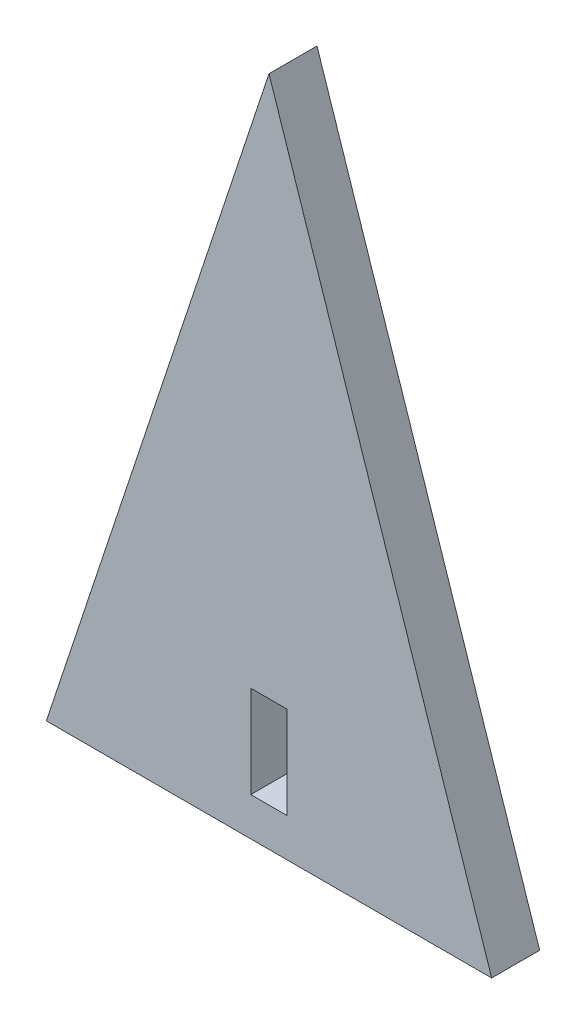
ISO-10303-21;
HEADER;
FILE_DESCRIPTION(('STEP AP214'),'2;1');
FILE_NAME('part.step','',(''),(''),'','','');
FILE_SCHEMA(('AUTOMOTIVE_DESIGN { 1 0 10303 214 1 1 1 1 }'));
ENDSEC;
DATA;
#1=APPLICATION_CONTEXT('core data for automotive mechanical design processes');
#2=APPLICATION_PROTOCOL_DEFINITION('international standard','automotive_design',2000,#1);
#3=PRODUCT_CONTEXT('',#1,'mechanical');
#4=PRODUCT('Part','Part','',(#3));
#5=PRODUCT_RELATED_PRODUCT_CATEGORY('part','',(#4));
#6=PRODUCT_DEFINITION_FORMATION('','',#4);
#7=PRODUCT_DEFINITION_CONTEXT('part definition',#1,'design');
#8=PRODUCT_DEFINITION('design','',#6,#7);
#9=PRODUCT_DEFINITION_SHAPE('','',#8);
#10=(LENGTH_UNIT() NAMED_UNIT(*) SI_UNIT(.MILLI.,.METRE.));
#11=(NAMED_UNIT(*) PLANE_ANGLE_UNIT() SI_UNIT($,.RADIAN.));
#12=(NAMED_UNIT(*) SI_UNIT($,.STERADIAN.) SOLID_ANGLE_UNIT());
#13=UNCERTAINTY_MEASURE_WITH_UNIT(LENGTH_MEASURE(1.E-05),#10,'distance_accuracy_value','');
#14=(GEOMETRIC_REPRESENTATION_CONTEXT(3) GLOBAL_UNCERTAINTY_ASSIGNED_CONTEXT((#13)) GLOBAL_UNIT_ASSIGNED_CONTEXT((#10,
#11,#12)) REPRESENTATION_CONTEXT('',''));
#15=CARTESIAN_POINT('',(0.,0.,0.));
#16=DIRECTION('',(0.,0.,1.));
#17=DIRECTION('',(1.,0.,0.));
#18=AXIS2_PLACEMENT_3D('',#15,#16,#17);
#19=CARTESIAN_POINT('',(0.,0.,3.175));
#20=DIRECTION('',(0.,0.,-1.));
#21=DIRECTION('',(-1.,0.,0.));
#22=AXIS2_PLACEMENT_3D('',#19,#20,#21);
#23=PLANE('',#22);
#24=DIRECTION('',(1.,0.,0.));
#25=VECTOR('',#24,1.);
#26=CARTESIAN_POINT('',(-16.0846255971627,-40.3688020775263,3.175));
#27=LINE('',#26,#25);
#28=CARTESIAN_POINT('',(-16.0846255971627,-40.3688020775263,3.175));
#29=VERTEX_POINT('',#28);
#30=CARTESIAN_POINT('',(13.3793744028373,-40.3688020775263,3.175));
#31=VERTEX_POINT('',#30);
#32=EDGE_CURVE('E134',#29,#31,#27,.T.);
#33=ORIENTED_EDGE('',*,*,#32,.T.);
#34=DIRECTION('',(-0.314600059139954,0.94922431637055,0.));
#35=VECTOR('',#34,1.);
#36=CARTESIAN_POINT('',(-1.35262559716273,4.08119792247373,3.175));
#37=LINE('',#36,#35);
#38=CARTESIAN_POINT('',(-1.35262559716273,4.08119792247373,3.175));
#39=VERTEX_POINT('',#38);
#40=EDGE_CURVE('E137',#31,#39,#37,.T.);
#41=ORIENTED_EDGE('',*,*,#40,.T.);
#42=DIRECTION('',(-0.314600059139954,-0.94922431637055,0.));
#43=VECTOR('',#42,1.);
#44=CARTESIAN_POINT('',(-16.0846255971627,-40.3688020775263,3.175));
#45=LINE('',#44,#43);
#46=EDGE_CURVE('E140',#39,#29,#45,.T.);
#47=ORIENTED_EDGE('',*,*,#46,.T.);
#48=EDGE_LOOP('',(#33,#41,#47));
#49=FACE_BOUND('',#48,.T.);
#50=DIRECTION('',(0.,-1.,0.));
#51=VECTOR('',#50,1.);
#52=CARTESIAN_POINT('',(-2.55912559716272,-37.8288020775262,3.175));
#53=LINE('',#52,#51);
#54=CARTESIAN_POINT('',(-2.55912559716272,-31.7328020775262,3.175));
#55=VERTEX_POINT('',#54);
#56=CARTESIAN_POINT('',(-2.55912559716272,-37.8288020775262,3.175));
#57=VERTEX_POINT('',#56);
#58=EDGE_CURVE('E98',#55,#57,#53,.T.);
#59=ORIENTED_EDGE('',*,*,#58,.F.);
#60=DIRECTION('',(-1.,0.,0.));
#61=VECTOR('',#60,1.);
#62=CARTESIAN_POINT('',(-2.55912559716272,-31.7328020775262,3.175));
#63=LINE('',#62,#61);
#64=CARTESIAN_POINT('',(-0.146125597162723,-31.7328020775262,3.175));
#65=VERTEX_POINT('',#64);
#66=EDGE_CURVE('E120',#65,#55,#63,.T.);
#67=ORIENTED_EDGE('',*,*,#66,.F.);
#68=DIRECTION('',(0.,1.,0.));
#69=VECTOR('',#68,1.);
#70=CARTESIAN_POINT('',(-0.146125597162723,-37.8288020775262,3.175));
#71=LINE('',#70,#69);
#72=CARTESIAN_POINT('',(-0.146125597162723,-37.8288020775262,3.175));
#73=VERTEX_POINT('',#72);
#74=EDGE_CURVE('E118',#73,#65,#71,.T.);
#75=ORIENTED_EDGE('',*,*,#74,.F.);
#76=DIRECTION('',(1.,0.,0.));
#77=VECTOR('',#76,1.);
#78=CARTESIAN_POINT('',(-2.55912559716272,-37.8288020775262,3.175));
#79=LINE('',#78,#77);
#80=EDGE_CURVE('E106',#57,#73,#79,.T.);
#81=ORIENTED_EDGE('',*,*,#80,.F.);
#82=EDGE_LOOP('',(#59,#67,#75,#81));
#83=FACE_BOUND('',#82,.T.);
#84=ADVANCED_FACE('F39',(#49,#83),#23,.F.);
#85=CARTESIAN_POINT('',(0.,0.,0.));
#86=DIRECTION('',(0.,0.,-1.));
#87=DIRECTION('',(-1.,0.,0.));
#88=AXIS2_PLACEMENT_3D('',#85,#86,#87);
#89=PLANE('',#88);
#90=DIRECTION('',(1.,0.,0.));
#91=VECTOR('',#90,1.);
#92=CARTESIAN_POINT('',(-16.0846255971627,-40.3688020775263,0.));
#93=LINE('',#92,#91);
#94=CARTESIAN_POINT('',(-16.0846255971627,-40.3688020775263,0.));
#95=VERTEX_POINT('',#94);
#96=CARTESIAN_POINT('',(13.3793744028373,-40.3688020775263,0.));
#97=VERTEX_POINT('',#96);
#98=EDGE_CURVE('E114',#95,#97,#93,.T.);
#99=ORIENTED_EDGE('',*,*,#98,.F.);
#100=DIRECTION('',(-0.314600059139954,-0.94922431637055,0.));
#101=VECTOR('',#100,1.);
#102=CARTESIAN_POINT('',(-16.0846255971627,-40.3688020775263,0.));
#103=LINE('',#102,#101);
#104=CARTESIAN_POINT('',(-1.35262559716273,4.08119792247373,0.));
#105=VERTEX_POINT('',#104);
#106=EDGE_CURVE('E138',#105,#95,#103,.T.);
#107=ORIENTED_EDGE('',*,*,#106,.F.);
#108=DIRECTION('',(-0.314600059139954,0.94922431637055,0.));
#109=VECTOR('',#108,1.);
#110=CARTESIAN_POINT('',(-1.35262559716273,4.08119792247373,0.));
#111=LINE('',#110,#109);
#112=EDGE_CURVE('E145',#97,#105,#111,.T.);
#113=ORIENTED_EDGE('',*,*,#112,.F.);
#114=EDGE_LOOP('',(#99,#107,#113));
#115=FACE_BOUND('',#114,.T.);
#116=DIRECTION('',(-1.,0.,0.));
#117=VECTOR('',#116,1.);
#118=CARTESIAN_POINT('',(-2.55912559716272,-31.7328020775262,0.));
#119=LINE('',#118,#117);
#120=CARTESIAN_POINT('',(-0.146125597162723,-31.7328020775262,0.));
#121=VERTEX_POINT('',#120);
#122=CARTESIAN_POINT('',(-2.55912559716272,-31.7328020775262,0.));
#123=VERTEX_POINT('',#122);
#124=EDGE_CURVE('E107',#121,#123,#119,.T.);
#125=ORIENTED_EDGE('',*,*,#124,.T.);
#126=DIRECTION('',(0.,-1.,0.));
#127=VECTOR('',#126,1.);
#128=CARTESIAN_POINT('',(-2.55912559716272,-37.8288020775262,0.));
#129=LINE('',#128,#127);
#130=CARTESIAN_POINT('',(-2.55912559716272,-37.8288020775262,0.));
#131=VERTEX_POINT('',#130);
#132=EDGE_CURVE('E62',#123,#131,#129,.T.);
#133=ORIENTED_EDGE('',*,*,#132,.T.);
#134=DIRECTION('',(1.,0.,0.));
#135=VECTOR('',#134,1.);
#136=CARTESIAN_POINT('',(-2.55912559716272,-37.8288020775262,0.));
#137=LINE('',#136,#135);
#138=CARTESIAN_POINT('',(-0.146125597162723,-37.8288020775262,0.));
#139=VERTEX_POINT('',#138);
#140=EDGE_CURVE('E113',#131,#139,#137,.T.);
#141=ORIENTED_EDGE('',*,*,#140,.T.);
#142=DIRECTION('',(0.,1.,0.));
#143=VECTOR('',#142,1.);
#144=CARTESIAN_POINT('',(-0.146125597162723,-37.8288020775262,0.));
#145=LINE('',#144,#143);
#146=EDGE_CURVE('E126',#139,#121,#145,.T.);
#147=ORIENTED_EDGE('',*,*,#146,.T.);
#148=EDGE_LOOP('',(#125,#133,#141,#147));
#149=FACE_BOUND('',#148,.T.);
#150=ADVANCED_FACE('F159',(#115,#149),#89,.T.);
#151=CARTESIAN_POINT('',(-16.0846255971627,-40.3688020775263,3.175));
#152=DIRECTION('',(0.,1.,0.));
#153=DIRECTION('',(0.,0.,1.));
#154=AXIS2_PLACEMENT_3D('',#151,#152,#153);
#155=PLANE('',#154);
#156=ORIENTED_EDGE('',*,*,#98,.T.);
#157=DIRECTION('',(0.,0.,-1.));
#158=VECTOR('',#157,1.);
#159=CARTESIAN_POINT('',(13.3793744028373,-40.3688020775263,3.175));
#160=LINE('',#159,#158);
#161=EDGE_CURVE('E11',#31,#97,#160,.T.);
#162=ORIENTED_EDGE('',*,*,#161,.F.);
#163=ORIENTED_EDGE('',*,*,#32,.F.);
#164=DIRECTION('',(0.,0.,-1.));
#165=VECTOR('',#164,1.);
#166=CARTESIAN_POINT('',(-16.0846255971627,-40.3688020775263,3.175));
#167=LINE('',#166,#165);
#168=EDGE_CURVE('E142',#29,#95,#167,.T.);
#169=ORIENTED_EDGE('',*,*,#168,.T.);
#170=EDGE_LOOP('',(#156,#162,#163,#169));
#171=FACE_BOUND('',#170,.T.);
#172=ADVANCED_FACE('F41',(#171),#155,.F.);
#173=CARTESIAN_POINT('',(-1.35262559716273,4.08119792247373,3.175));
#174=DIRECTION('',(-0.94922431637055,-0.314600059139954,0.));
#175=DIRECTION('',(0.314600059139954,-0.94922431637055,0.));
#176=AXIS2_PLACEMENT_3D('',#173,#174,#175);
#177=PLANE('',#176);
#178=ORIENTED_EDGE('',*,*,#112,.T.);
#179=DIRECTION('',(0.,0.,-1.));
#180=VECTOR('',#179,1.);
#181=CARTESIAN_POINT('',(-1.35262559716273,4.08119792247373,3.175));
#182=LINE('',#181,#180);
#183=EDGE_CURVE('E47',#39,#105,#182,.T.);
#184=ORIENTED_EDGE('',*,*,#183,.F.);
#185=ORIENTED_EDGE('',*,*,#40,.F.);
#186=ORIENTED_EDGE('',*,*,#161,.T.);
#187=EDGE_LOOP('',(#178,#184,#185,#186));
#188=FACE_BOUND('',#187,.T.);
#189=ADVANCED_FACE('F165',(#188),#177,.F.);
#190=CARTESIAN_POINT('',(-16.0846255971627,-40.3688020775263,3.175));
#191=DIRECTION('',(0.94922431637055,-0.314600059139954,0.));
#192=DIRECTION('',(0.314600059139954,0.94922431637055,0.));
#193=AXIS2_PLACEMENT_3D('',#190,#191,#192);
#194=PLANE('',#193);
#195=ORIENTED_EDGE('',*,*,#106,.T.);
#196=ORIENTED_EDGE('',*,*,#168,.F.);
#197=ORIENTED_EDGE('',*,*,#46,.F.);
#198=ORIENTED_EDGE('',*,*,#183,.T.);
#199=EDGE_LOOP('',(#195,#196,#197,#198));
#200=FACE_BOUND('',#199,.T.);
#201=ADVANCED_FACE('F154',(#200),#194,.F.);
#202=CARTESIAN_POINT('',(-2.55912559716272,-37.8288020775262,3.175));
#203=DIRECTION('',(1.,0.,0.));
#204=DIRECTION('',(0.,0.,-1.));
#205=AXIS2_PLACEMENT_3D('',#202,#203,#204);
#206=PLANE('',#205);
#207=ORIENTED_EDGE('',*,*,#132,.F.);
#208=DIRECTION('',(0.,0.,-1.));
#209=VECTOR('',#208,1.);
#210=CARTESIAN_POINT('',(-2.55912559716272,-31.7328020775262,3.175));
#211=LINE('',#210,#209);
#212=EDGE_CURVE('E102',#55,#123,#211,.T.);
#213=ORIENTED_EDGE('',*,*,#212,.F.);
#214=ORIENTED_EDGE('',*,*,#58,.T.);
#215=DIRECTION('',(0.,0.,-1.));
#216=VECTOR('',#215,1.);
#217=CARTESIAN_POINT('',(-2.55912559716272,-37.8288020775262,3.175));
#218=LINE('',#217,#216);
#219=EDGE_CURVE('E101',#57,#131,#218,.T.);
#220=ORIENTED_EDGE('',*,*,#219,.T.);
#221=EDGE_LOOP('',(#207,#213,#214,#220));
#222=FACE_BOUND('',#221,.T.);
#223=ADVANCED_FACE('F100',(#222),#206,.T.);
#224=CARTESIAN_POINT('',(-2.55912559716272,-37.8288020775262,3.175));
#225=DIRECTION('',(0.,1.,0.));
#226=DIRECTION('',(0.,0.,1.));
#227=AXIS2_PLACEMENT_3D('',#224,#225,#226);
#228=PLANE('',#227);
#229=ORIENTED_EDGE('',*,*,#140,.F.);
#230=ORIENTED_EDGE('',*,*,#219,.F.);
#231=ORIENTED_EDGE('',*,*,#80,.T.);
#232=DIRECTION('',(0.,0.,-1.));
#233=VECTOR('',#232,1.);
#234=CARTESIAN_POINT('',(-0.146125597162723,-37.8288020775262,3.175));
#235=LINE('',#234,#233);
#236=EDGE_CURVE('E115',#73,#139,#235,.T.);
#237=ORIENTED_EDGE('',*,*,#236,.T.);
#238=EDGE_LOOP('',(#229,#230,#231,#237));
#239=FACE_BOUND('',#238,.T.);
#240=ADVANCED_FACE('F110',(#239),#228,.T.);
#241=CARTESIAN_POINT('',(-0.146125597162723,-37.8288020775262,3.175));
#242=DIRECTION('',(-1.,0.,0.));
#243=DIRECTION('',(0.,0.,1.));
#244=AXIS2_PLACEMENT_3D('',#241,#242,#243);
#245=PLANE('',#244);
#246=ORIENTED_EDGE('',*,*,#146,.F.);
#247=ORIENTED_EDGE('',*,*,#236,.F.);
#248=ORIENTED_EDGE('',*,*,#74,.T.);
#249=DIRECTION('',(0.,0.,-1.));
#250=VECTOR('',#249,1.);
#251=CARTESIAN_POINT('',(-0.146125597162723,-31.7328020775262,3.175));
#252=LINE('',#251,#250);
#253=EDGE_CURVE('E54',#65,#121,#252,.T.);
#254=ORIENTED_EDGE('',*,*,#253,.T.);
#255=EDGE_LOOP('',(#246,#247,#248,#254));
#256=FACE_BOUND('',#255,.T.);
#257=ADVANCED_FACE('F183',(#256),#245,.T.);
#258=CARTESIAN_POINT('',(-2.55912559716272,-31.7328020775262,3.175));
#259=DIRECTION('',(0.,-1.,0.));
#260=DIRECTION('',(0.,0.,-1.));
#261=AXIS2_PLACEMENT_3D('',#258,#259,#260);
#262=PLANE('',#261);
#263=ORIENTED_EDGE('',*,*,#124,.F.);
#264=ORIENTED_EDGE('',*,*,#253,.F.);
#265=ORIENTED_EDGE('',*,*,#66,.T.);
#266=ORIENTED_EDGE('',*,*,#212,.T.);
#267=EDGE_LOOP('',(#263,#264,#265,#266));
#268=FACE_BOUND('',#267,.T.);
#269=ADVANCED_FACE('F186',(#268),#262,.T.);
#270=CLOSED_SHELL('',(#84,#150,#172,#189,#201,#223,#240,#257,#269));
#271=MANIFOLD_SOLID_BREP('B2',#270);
#272=ADVANCED_BREP_SHAPE_REPRESENTATION('',(#18,#271),#14);
#273=SHAPE_DEFINITION_REPRESENTATION(#9,#272);
ENDSEC;
END-ISO-10303-21;
